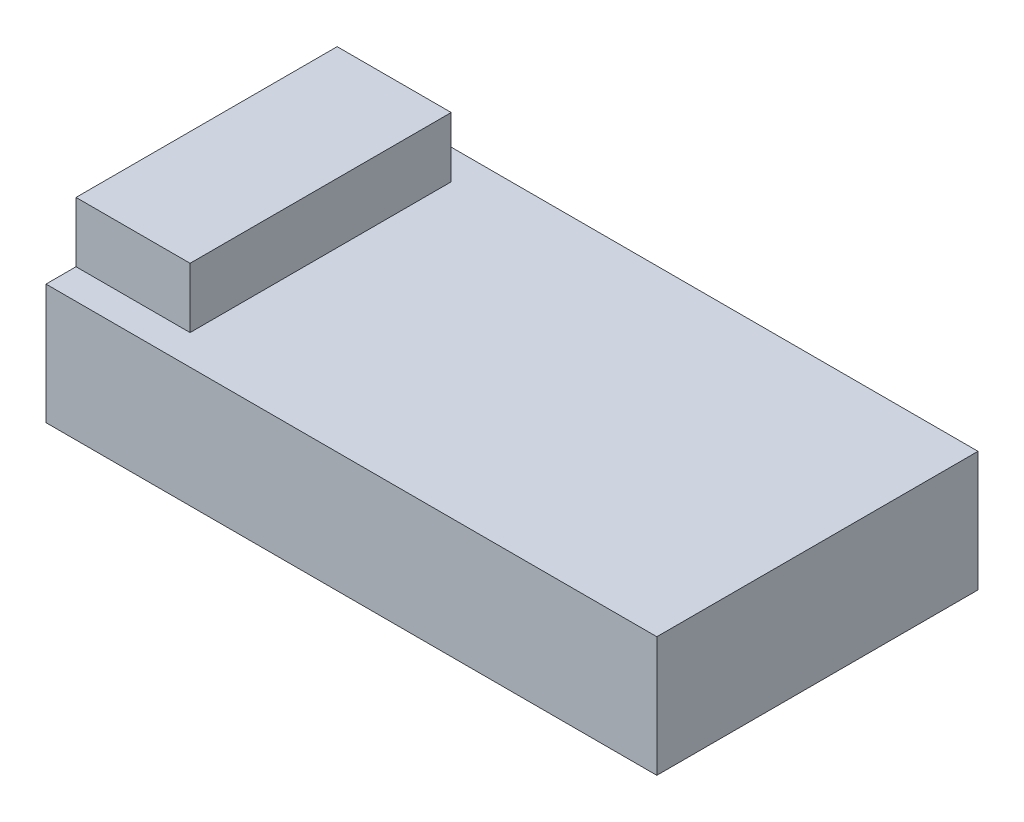
ISO-10303-21;
HEADER;
FILE_DESCRIPTION(('STEP AP214'),'2;1');
FILE_NAME('part.step','',(''),(''),'','','');
FILE_SCHEMA(('AUTOMOTIVE_DESIGN { 1 0 10303 214 1 1 1 1 }'));
ENDSEC;
DATA;
#1=APPLICATION_CONTEXT('core data for automotive mechanical design processes');
#2=APPLICATION_PROTOCOL_DEFINITION('international standard','automotive_design',2000,#1);
#3=PRODUCT_CONTEXT('',#1,'mechanical');
#4=PRODUCT('Part','Part','',(#3));
#5=PRODUCT_RELATED_PRODUCT_CATEGORY('part','',(#4));
#6=PRODUCT_DEFINITION_FORMATION('','',#4);
#7=PRODUCT_DEFINITION_CONTEXT('part definition',#1,'design');
#8=PRODUCT_DEFINITION('design','',#6,#7);
#9=PRODUCT_DEFINITION_SHAPE('','',#8);
#10=(LENGTH_UNIT() NAMED_UNIT(*) SI_UNIT(.MILLI.,.METRE.));
#11=(NAMED_UNIT(*) PLANE_ANGLE_UNIT() SI_UNIT($,.RADIAN.));
#12=(NAMED_UNIT(*) SI_UNIT($,.STERADIAN.) SOLID_ANGLE_UNIT());
#13=UNCERTAINTY_MEASURE_WITH_UNIT(LENGTH_MEASURE(1.E-05),#10,'distance_accuracy_value','');
#14=(GEOMETRIC_REPRESENTATION_CONTEXT(3) GLOBAL_UNCERTAINTY_ASSIGNED_CONTEXT((#13)) GLOBAL_UNIT_ASSIGNED_CONTEXT((#10,
#11,#12)) REPRESENTATION_CONTEXT('',''));
#15=CARTESIAN_POINT('',(0.,0.,0.));
#16=DIRECTION('',(0.,0.,1.));
#17=DIRECTION('',(1.,0.,0.));
#18=AXIS2_PLACEMENT_3D('',#15,#16,#17);
#19=CARTESIAN_POINT('',(0.,8.,0.));
#20=DIRECTION('',(0.,-1.,0.));
#21=DIRECTION('',(0.,0.,-1.));
#22=AXIS2_PLACEMENT_3D('',#19,#20,#21);
#23=PLANE('',#22);
#24=DIRECTION('',(1.,0.,0.));
#25=VECTOR('',#24,1.);
#26=CARTESIAN_POINT('',(-20.35,8.,8.7));
#27=LINE('',#26,#25);
#28=CARTESIAN_POINT('',(-20.35,8.,8.7));
#29=VERTEX_POINT('',#28);
#30=CARTESIAN_POINT('',(-12.75,8.,8.7));
#31=VERTEX_POINT('',#30);
#32=EDGE_CURVE('E130',#29,#31,#27,.T.);
#33=ORIENTED_EDGE('',*,*,#32,.F.);
#34=DIRECTION('',(0.,0.,1.));
#35=VECTOR('',#34,1.);
#36=CARTESIAN_POINT('',(-20.35,8.,10.7));
#37=LINE('',#36,#35);
#38=CARTESIAN_POINT('',(-20.35,8.,10.7));
#39=VERTEX_POINT('',#38);
#40=EDGE_CURVE('E153',#29,#39,#37,.T.);
#41=ORIENTED_EDGE('',*,*,#40,.T.);
#42=DIRECTION('',(1.,0.,0.));
#43=VECTOR('',#42,1.);
#44=CARTESIAN_POINT('',(-20.35,8.,10.7));
#45=LINE('',#44,#43);
#46=CARTESIAN_POINT('',(20.35,8.,10.7));
#47=VERTEX_POINT('',#46);
#48=EDGE_CURVE('E157',#39,#47,#45,.T.);
#49=ORIENTED_EDGE('',*,*,#48,.T.);
#50=DIRECTION('',(0.,0.,-1.));
#51=VECTOR('',#50,1.);
#52=CARTESIAN_POINT('',(20.35,8.,10.7));
#53=LINE('',#52,#51);
#54=CARTESIAN_POINT('',(20.35,8.,-10.7));
#55=VERTEX_POINT('',#54);
#56=EDGE_CURVE('E145',#47,#55,#53,.T.);
#57=ORIENTED_EDGE('',*,*,#56,.T.);
#58=DIRECTION('',(-1.,0.,0.));
#59=VECTOR('',#58,1.);
#60=CARTESIAN_POINT('',(-20.35,8.,-10.7));
#61=LINE('',#60,#59);
#62=CARTESIAN_POINT('',(-20.35,8.,-10.7));
#63=VERTEX_POINT('',#62);
#64=EDGE_CURVE('E149',#55,#63,#61,.T.);
#65=ORIENTED_EDGE('',*,*,#64,.T.);
#66=CARTESIAN_POINT('',(-20.35,8.,-8.7));
#67=VERTEX_POINT('',#66);
#68=EDGE_CURVE('E154',#63,#67,#37,.T.);
#69=ORIENTED_EDGE('',*,*,#68,.T.);
#70=DIRECTION('',(-1.,0.,0.));
#71=VECTOR('',#70,1.);
#72=CARTESIAN_POINT('',(-20.35,8.,-8.7));
#73=LINE('',#72,#71);
#74=CARTESIAN_POINT('',(-12.75,8.,-8.7));
#75=VERTEX_POINT('',#74);
#76=EDGE_CURVE('E66',#75,#67,#73,.T.);
#77=ORIENTED_EDGE('',*,*,#76,.F.);
#78=DIRECTION('',(0.,0.,-1.));
#79=VECTOR('',#78,1.);
#80=CARTESIAN_POINT('',(-12.75,8.,8.7));
#81=LINE('',#80,#79);
#82=EDGE_CURVE('E61',#31,#75,#81,.T.);
#83=ORIENTED_EDGE('',*,*,#82,.F.);
#84=EDGE_LOOP('',(#33,#41,#49,#57,#65,#69,#77,#83));
#85=FACE_BOUND('',#84,.T.);
#86=ADVANCED_FACE('F45',(#85),#23,.F.);
#87=CARTESIAN_POINT('',(20.35,8.,10.7));
#88=DIRECTION('',(-1.,0.,0.));
#89=DIRECTION('',(0.,0.,1.));
#90=AXIS2_PLACEMENT_3D('',#87,#88,#89);
#91=PLANE('',#90);
#92=DIRECTION('',(0.,0.,-1.));
#93=VECTOR('',#92,1.);
#94=CARTESIAN_POINT('',(20.35,0.,10.7));
#95=LINE('',#94,#93);
#96=CARTESIAN_POINT('',(20.35,0.,10.7));
#97=VERTEX_POINT('',#96);
#98=CARTESIAN_POINT('',(20.35,0.,-10.7));
#99=VERTEX_POINT('',#98);
#100=EDGE_CURVE('E134',#97,#99,#95,.T.);
#101=ORIENTED_EDGE('',*,*,#100,.T.);
#102=DIRECTION('',(0.,-1.,0.));
#103=VECTOR('',#102,1.);
#104=CARTESIAN_POINT('',(20.35,8.,-10.7));
#105=LINE('',#104,#103);
#106=EDGE_CURVE('E11',#55,#99,#105,.T.);
#107=ORIENTED_EDGE('',*,*,#106,.F.);
#108=ORIENTED_EDGE('',*,*,#56,.F.);
#109=DIRECTION('',(0.,-1.,0.));
#110=VECTOR('',#109,1.);
#111=CARTESIAN_POINT('',(20.35,8.,10.7));
#112=LINE('',#111,#110);
#113=EDGE_CURVE('E159',#47,#97,#112,.T.);
#114=ORIENTED_EDGE('',*,*,#113,.T.);
#115=EDGE_LOOP('',(#101,#107,#108,#114));
#116=FACE_BOUND('',#115,.T.);
#117=ADVANCED_FACE('F47',(#116),#91,.F.);
#118=CARTESIAN_POINT('',(-20.35,8.,-10.7));
#119=DIRECTION('',(0.,0.,1.));
#120=DIRECTION('',(1.,0.,0.));
#121=AXIS2_PLACEMENT_3D('',#118,#119,#120);
#122=PLANE('',#121);
#123=DIRECTION('',(-1.,0.,0.));
#124=VECTOR('',#123,1.);
#125=CARTESIAN_POINT('',(-20.35,0.,-10.7));
#126=LINE('',#125,#124);
#127=CARTESIAN_POINT('',(-20.35,0.,-10.7));
#128=VERTEX_POINT('',#127);
#129=EDGE_CURVE('E139',#99,#128,#126,.T.);
#130=ORIENTED_EDGE('',*,*,#129,.T.);
#131=DIRECTION('',(0.,-1.,0.));
#132=VECTOR('',#131,1.);
#133=CARTESIAN_POINT('',(-20.35,8.,-10.7));
#134=LINE('',#133,#132);
#135=EDGE_CURVE('E54',#63,#128,#134,.T.);
#136=ORIENTED_EDGE('',*,*,#135,.F.);
#137=ORIENTED_EDGE('',*,*,#64,.F.);
#138=ORIENTED_EDGE('',*,*,#106,.T.);
#139=EDGE_LOOP('',(#130,#136,#137,#138));
#140=FACE_BOUND('',#139,.T.);
#141=ADVANCED_FACE('F227',(#140),#122,.F.);
#142=CARTESIAN_POINT('',(-20.35,8.,10.7));
#143=DIRECTION('',(1.,0.,0.));
#144=DIRECTION('',(0.,0.,-1.));
#145=AXIS2_PLACEMENT_3D('',#142,#143,#144);
#146=PLANE('',#145);
#147=DIRECTION('',(0.,0.,1.));
#148=VECTOR('',#147,1.);
#149=CARTESIAN_POINT('',(-20.35,0.,10.7));
#150=LINE('',#149,#148);
#151=CARTESIAN_POINT('',(-20.35,0.,10.7));
#152=VERTEX_POINT('',#151);
#153=EDGE_CURVE('E163',#128,#152,#150,.T.);
#154=ORIENTED_EDGE('',*,*,#153,.T.);
#155=DIRECTION('',(0.,-1.,0.));
#156=VECTOR('',#155,1.);
#157=CARTESIAN_POINT('',(-20.35,8.,10.7));
#158=LINE('',#157,#156);
#159=EDGE_CURVE('E171',#39,#152,#158,.T.);
#160=ORIENTED_EDGE('',*,*,#159,.F.);
#161=ORIENTED_EDGE('',*,*,#40,.F.);
#162=DIRECTION('',(0.,-1.,0.));
#163=VECTOR('',#162,1.);
#164=CARTESIAN_POINT('',(-20.35,12.,8.7));
#165=LINE('',#164,#163);
#166=CARTESIAN_POINT('',(-20.35,12.,8.7));
#167=VERTEX_POINT('',#166);
#168=EDGE_CURVE('E141',#167,#29,#165,.T.);
#169=ORIENTED_EDGE('',*,*,#168,.F.);
#170=DIRECTION('',(0.,0.,1.));
#171=VECTOR('',#170,1.);
#172=CARTESIAN_POINT('',(-20.35,12.,8.7));
#173=LINE('',#172,#171);
#174=CARTESIAN_POINT('',(-20.35,12.,-8.7));
#175=VERTEX_POINT('',#174);
#176=EDGE_CURVE('E119',#175,#167,#173,.T.);
#177=ORIENTED_EDGE('',*,*,#176,.F.);
#178=DIRECTION('',(0.,-1.,0.));
#179=VECTOR('',#178,1.);
#180=CARTESIAN_POINT('',(-20.35,12.,-8.7));
#181=LINE('',#180,#179);
#182=EDGE_CURVE('E115',#175,#67,#181,.T.);
#183=ORIENTED_EDGE('',*,*,#182,.T.);
#184=ORIENTED_EDGE('',*,*,#68,.F.);
#185=ORIENTED_EDGE('',*,*,#135,.T.);
#186=EDGE_LOOP('',(#154,#160,#161,#169,#177,#183,#184,#185));
#187=FACE_BOUND('',#186,.T.);
#188=ADVANCED_FACE('F180',(#187),#146,.F.);
#189=CARTESIAN_POINT('',(-20.35,8.,10.7));
#190=DIRECTION('',(0.,0.,-1.));
#191=DIRECTION('',(-1.,0.,0.));
#192=AXIS2_PLACEMENT_3D('',#189,#190,#191);
#193=PLANE('',#192);
#194=DIRECTION('',(1.,0.,0.));
#195=VECTOR('',#194,1.);
#196=CARTESIAN_POINT('',(-20.35,0.,10.7));
#197=LINE('',#196,#195);
#198=EDGE_CURVE('E150',#152,#97,#197,.T.);
#199=ORIENTED_EDGE('',*,*,#198,.T.);
#200=ORIENTED_EDGE('',*,*,#113,.F.);
#201=ORIENTED_EDGE('',*,*,#48,.F.);
#202=ORIENTED_EDGE('',*,*,#159,.T.);
#203=EDGE_LOOP('',(#199,#200,#201,#202));
#204=FACE_BOUND('',#203,.T.);
#205=ADVANCED_FACE('F189',(#204),#193,.F.);
#206=CARTESIAN_POINT('',(0.,0.,0.));
#207=DIRECTION('',(0.,-1.,0.));
#208=DIRECTION('',(0.,0.,-1.));
#209=AXIS2_PLACEMENT_3D('',#206,#207,#208);
#210=PLANE('',#209);
#211=ORIENTED_EDGE('',*,*,#100,.F.);
#212=ORIENTED_EDGE('',*,*,#198,.F.);
#213=ORIENTED_EDGE('',*,*,#153,.F.);
#214=ORIENTED_EDGE('',*,*,#129,.F.);
#215=EDGE_LOOP('',(#211,#212,#213,#214));
#216=FACE_BOUND('',#215,.T.);
#217=ADVANCED_FACE('F186',(#216),#210,.T.);
#218=CARTESIAN_POINT('',(-12.75,12.,8.7));
#219=DIRECTION('',(-1.,0.,0.));
#220=DIRECTION('',(0.,0.,1.));
#221=AXIS2_PLACEMENT_3D('',#218,#219,#220);
#222=PLANE('',#221);
#223=ORIENTED_EDGE('',*,*,#82,.T.);
#224=DIRECTION('',(0.,-1.,0.));
#225=VECTOR('',#224,1.);
#226=CARTESIAN_POINT('',(-12.75,12.,-8.7));
#227=LINE('',#226,#225);
#228=CARTESIAN_POINT('',(-12.75,12.,-8.7));
#229=VERTEX_POINT('',#228);
#230=EDGE_CURVE('E113',#229,#75,#227,.T.);
#231=ORIENTED_EDGE('',*,*,#230,.F.);
#232=DIRECTION('',(0.,0.,-1.));
#233=VECTOR('',#232,1.);
#234=CARTESIAN_POINT('',(-12.75,12.,8.7));
#235=LINE('',#234,#233);
#236=CARTESIAN_POINT('',(-12.75,12.,8.7));
#237=VERTEX_POINT('',#236);
#238=EDGE_CURVE('E120',#237,#229,#235,.T.);
#239=ORIENTED_EDGE('',*,*,#238,.F.);
#240=DIRECTION('',(0.,-1.,0.));
#241=VECTOR('',#240,1.);
#242=CARTESIAN_POINT('',(-12.75,12.,8.7));
#243=LINE('',#242,#241);
#244=EDGE_CURVE('E201',#237,#31,#243,.T.);
#245=ORIENTED_EDGE('',*,*,#244,.T.);
#246=EDGE_LOOP('',(#223,#231,#239,#245));
#247=FACE_BOUND('',#246,.T.);
#248=ADVANCED_FACE('F132',(#247),#222,.F.);
#249=CARTESIAN_POINT('',(-20.35,12.,-8.7));
#250=DIRECTION('',(0.,0.,1.));
#251=DIRECTION('',(1.,0.,0.));
#252=AXIS2_PLACEMENT_3D('',#249,#250,#251);
#253=PLANE('',#252);
#254=ORIENTED_EDGE('',*,*,#76,.T.);
#255=ORIENTED_EDGE('',*,*,#182,.F.);
#256=DIRECTION('',(-1.,0.,0.));
#257=VECTOR('',#256,1.);
#258=CARTESIAN_POINT('',(-20.35,12.,-8.7));
#259=LINE('',#258,#257);
#260=EDGE_CURVE('E109',#229,#175,#259,.T.);
#261=ORIENTED_EDGE('',*,*,#260,.F.);
#262=ORIENTED_EDGE('',*,*,#230,.T.);
#263=EDGE_LOOP('',(#254,#255,#261,#262));
#264=FACE_BOUND('',#263,.T.);
#265=ADVANCED_FACE('F111',(#264),#253,.F.);
#266=CARTESIAN_POINT('',(-20.35,12.,8.7));
#267=DIRECTION('',(0.,0.,-1.));
#268=DIRECTION('',(-1.,0.,0.));
#269=AXIS2_PLACEMENT_3D('',#266,#267,#268);
#270=PLANE('',#269);
#271=ORIENTED_EDGE('',*,*,#32,.T.);
#272=ORIENTED_EDGE('',*,*,#244,.F.);
#273=DIRECTION('',(1.,0.,0.));
#274=VECTOR('',#273,1.);
#275=CARTESIAN_POINT('',(-20.35,12.,8.7));
#276=LINE('',#275,#274);
#277=EDGE_CURVE('E125',#167,#237,#276,.T.);
#278=ORIENTED_EDGE('',*,*,#277,.F.);
#279=ORIENTED_EDGE('',*,*,#168,.T.);
#280=EDGE_LOOP('',(#271,#272,#278,#279));
#281=FACE_BOUND('',#280,.T.);
#282=ADVANCED_FACE('F199',(#281),#270,.F.);
#283=CARTESIAN_POINT('',(0.,12.,0.));
#284=DIRECTION('',(0.,-1.,0.));
#285=DIRECTION('',(0.,0.,-1.));
#286=AXIS2_PLACEMENT_3D('',#283,#284,#285);
#287=PLANE('',#286);
#288=ORIENTED_EDGE('',*,*,#238,.T.);
#289=ORIENTED_EDGE('',*,*,#260,.T.);
#290=ORIENTED_EDGE('',*,*,#176,.T.);
#291=ORIENTED_EDGE('',*,*,#277,.T.);
#292=EDGE_LOOP('',(#288,#289,#290,#291));
#293=FACE_BOUND('',#292,.T.);
#294=ADVANCED_FACE('F123',(#293),#287,.F.);
#295=CLOSED_SHELL('',(#86,#117,#141,#188,#205,#217,#248,#265,#282,#294));
#296=MANIFOLD_SOLID_BREP('B2',#295);
#297=ADVANCED_BREP_SHAPE_REPRESENTATION('',(#18,#296),#14);
#298=SHAPE_DEFINITION_REPRESENTATION(#9,#297);
ENDSEC;
END-ISO-10303-21;
